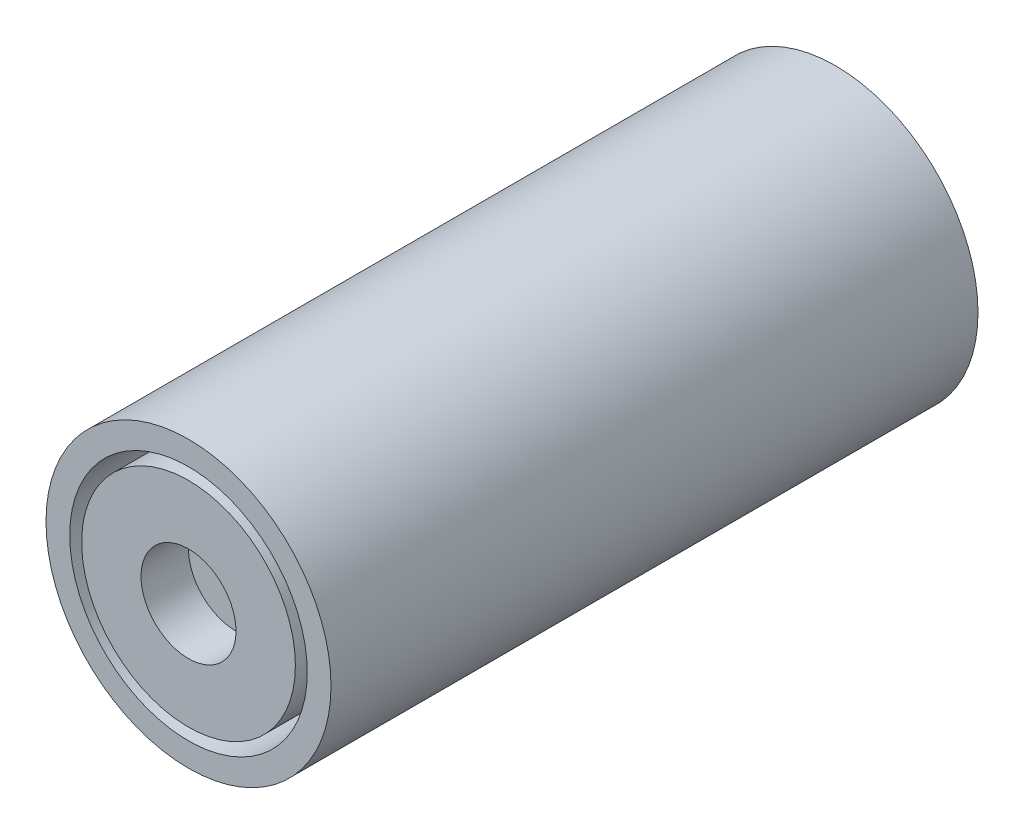
ISO-10303-21;
HEADER;
FILE_DESCRIPTION(('STEP AP214'),'2;1');
FILE_NAME('part.step','',(''),(''),'','','');
FILE_SCHEMA(('AUTOMOTIVE_DESIGN { 1 0 10303 214 1 1 1 1 }'));
ENDSEC;
DATA;
#1=APPLICATION_CONTEXT('core data for automotive mechanical design processes');
#2=APPLICATION_PROTOCOL_DEFINITION('international standard','automotive_design',2000,#1);
#3=PRODUCT_CONTEXT('',#1,'mechanical');
#4=PRODUCT('Part','Part','',(#3));
#5=PRODUCT_RELATED_PRODUCT_CATEGORY('part','',(#4));
#6=PRODUCT_DEFINITION_FORMATION('','',#4);
#7=PRODUCT_DEFINITION_CONTEXT('part definition',#1,'design');
#8=PRODUCT_DEFINITION('design','',#6,#7);
#9=PRODUCT_DEFINITION_SHAPE('','',#8);
#10=(LENGTH_UNIT() NAMED_UNIT(*) SI_UNIT(.MILLI.,.METRE.));
#11=(NAMED_UNIT(*) PLANE_ANGLE_UNIT() SI_UNIT($,.RADIAN.));
#12=(NAMED_UNIT(*) SI_UNIT($,.STERADIAN.) SOLID_ANGLE_UNIT());
#13=UNCERTAINTY_MEASURE_WITH_UNIT(LENGTH_MEASURE(1.E-05),#10,'distance_accuracy_value','');
#14=(GEOMETRIC_REPRESENTATION_CONTEXT(3) GLOBAL_UNCERTAINTY_ASSIGNED_CONTEXT((#13)) GLOBAL_UNIT_ASSIGNED_CONTEXT((#10,
#11,#12)) REPRESENTATION_CONTEXT('',''));
#15=CARTESIAN_POINT('',(0.,0.,0.));
#16=DIRECTION('',(0.,0.,1.));
#17=DIRECTION('',(1.,0.,0.));
#18=AXIS2_PLACEMENT_3D('',#15,#16,#17);
#19=CARTESIAN_POINT('',(0.,0.,-17.2974));
#20=DIRECTION('',(0.,0.,1.));
#21=DIRECTION('',(1.,0.,0.));
#22=AXIS2_PLACEMENT_3D('',#19,#20,#21);
#23=CYLINDRICAL_SURFACE('',#22,3.81);
#24=CARTESIAN_POINT('',(0.,0.,-17.2974));
#25=DIRECTION('',(0.,0.,1.));
#26=DIRECTION('',(1.,0.,0.));
#27=AXIS2_PLACEMENT_3D('',#24,#25,#26);
#28=CIRCLE('',#27,3.81);
#29=CARTESIAN_POINT('',(3.81,0.,-17.2974));
#30=VERTEX_POINT('',#29);
#31=EDGE_CURVE('E11',#30,#30,#28,.T.);
#32=ORIENTED_EDGE('',*,*,#31,.T.);
#33=EDGE_LOOP('',(#32));
#34=FACE_BOUND('',#33,.T.);
#35=CARTESIAN_POINT('',(0.,0.,0.));
#36=DIRECTION('',(0.,0.,1.));
#37=DIRECTION('',(1.,0.,0.));
#38=AXIS2_PLACEMENT_3D('',#35,#36,#37);
#39=CIRCLE('',#38,3.81);
#40=CARTESIAN_POINT('',(3.81,0.,0.));
#41=VERTEX_POINT('',#40);
#42=EDGE_CURVE('E42',#41,#41,#39,.T.);
#43=ORIENTED_EDGE('',*,*,#42,.F.);
#44=EDGE_LOOP('',(#43));
#45=FACE_BOUND('',#44,.T.);
#46=ADVANCED_FACE('F39',(#34,#45),#23,.T.);
#47=CARTESIAN_POINT('',(0.,0.,-17.2974));
#48=DIRECTION('',(0.,0.,1.));
#49=DIRECTION('',(1.,0.,0.));
#50=AXIS2_PLACEMENT_3D('',#47,#48,#49);
#51=PLANE('',#50);
#52=ORIENTED_EDGE('',*,*,#31,.F.);
#53=EDGE_LOOP('',(#52));
#54=FACE_BOUND('',#53,.T.);
#55=ADVANCED_FACE('F95',(#54),#51,.F.);
#56=CARTESIAN_POINT('',(0.,0.,0.));
#57=DIRECTION('',(0.,0.,1.));
#58=DIRECTION('',(1.,0.,0.));
#59=AXIS2_PLACEMENT_3D('',#56,#57,#58);
#60=PLANE('',#59);
#61=CARTESIAN_POINT('',(0.,0.,0.));
#62=DIRECTION('',(0.,0.,1.));
#63=DIRECTION('',(1.,0.,0.));
#64=AXIS2_PLACEMENT_3D('',#61,#62,#63);
#65=CIRCLE('',#64,3.175);
#66=CARTESIAN_POINT('',(3.175,0.,0.));
#67=VERTEX_POINT('',#66);
#68=EDGE_CURVE('E51',#67,#67,#65,.T.);
#69=ORIENTED_EDGE('',*,*,#68,.F.);
#70=EDGE_LOOP('',(#69));
#71=FACE_BOUND('',#70,.T.);
#72=ORIENTED_EDGE('',*,*,#42,.T.);
#73=EDGE_LOOP('',(#72));
#74=FACE_BOUND('',#73,.T.);
#75=ADVANCED_FACE('F81',(#71,#74),#60,.T.);
#76=CARTESIAN_POINT('',(0.,0.,-2.54));
#77=DIRECTION('',(0.,0.,1.));
#78=DIRECTION('',(1.,0.,0.));
#79=AXIS2_PLACEMENT_3D('',#76,#77,#78);
#80=CYLINDRICAL_SURFACE('',#79,3.175);
#81=CARTESIAN_POINT('',(0.,0.,-2.54));
#82=DIRECTION('',(0.,0.,1.));
#83=DIRECTION('',(1.,0.,0.));
#84=AXIS2_PLACEMENT_3D('',#81,#82,#83);
#85=CIRCLE('',#84,3.175);
#86=CARTESIAN_POINT('',(3.175,0.,-2.54));
#87=VERTEX_POINT('',#86);
#88=EDGE_CURVE('E49',#87,#87,#85,.T.);
#89=ORIENTED_EDGE('',*,*,#88,.F.);
#90=EDGE_LOOP('',(#89));
#91=FACE_BOUND('',#90,.T.);
#92=ORIENTED_EDGE('',*,*,#68,.T.);
#93=EDGE_LOOP('',(#92));
#94=FACE_BOUND('',#93,.T.);
#95=ADVANCED_FACE('F91',(#91,#94),#80,.F.);
#96=CARTESIAN_POINT('',(0.,0.,-2.54));
#97=DIRECTION('',(0.,0.,1.));
#98=DIRECTION('',(1.,0.,0.));
#99=AXIS2_PLACEMENT_3D('',#96,#97,#98);
#100=PLANE('',#99);
#101=CARTESIAN_POINT('',(0.,0.,-2.54));
#102=DIRECTION('',(0.,0.,1.));
#103=DIRECTION('',(1.,0.,0.));
#104=AXIS2_PLACEMENT_3D('',#101,#102,#103);
#105=CIRCLE('',#104,2.8575);
#106=CARTESIAN_POINT('',(2.8575,0.,-2.54));
#107=VERTEX_POINT('',#106);
#108=EDGE_CURVE('E54',#107,#107,#105,.T.);
#109=ORIENTED_EDGE('',*,*,#108,.F.);
#110=EDGE_LOOP('',(#109));
#111=FACE_BOUND('',#110,.T.);
#112=ORIENTED_EDGE('',*,*,#88,.T.);
#113=EDGE_LOOP('',(#112));
#114=FACE_BOUND('',#113,.T.);
#115=ADVANCED_FACE('F85',(#111,#114),#100,.T.);
#116=CARTESIAN_POINT('',(0.,0.,-2.54));
#117=DIRECTION('',(0.,0.,1.));
#118=DIRECTION('',(1.,0.,0.));
#119=AXIS2_PLACEMENT_3D('',#116,#117,#118);
#120=CYLINDRICAL_SURFACE('',#119,2.8575);
#121=ORIENTED_EDGE('',*,*,#108,.T.);
#122=EDGE_LOOP('',(#121));
#123=FACE_BOUND('',#122,.T.);
#124=CARTESIAN_POINT('',(0.,0.,0.));
#125=DIRECTION('',(0.,0.,1.));
#126=DIRECTION('',(1.,0.,0.));
#127=AXIS2_PLACEMENT_3D('',#124,#125,#126);
#128=CIRCLE('',#127,2.8575);
#129=CARTESIAN_POINT('',(2.8575,0.,0.));
#130=VERTEX_POINT('',#129);
#131=EDGE_CURVE('E57',#130,#130,#128,.T.);
#132=ORIENTED_EDGE('',*,*,#131,.F.);
#133=EDGE_LOOP('',(#132));
#134=FACE_BOUND('',#133,.T.);
#135=ADVANCED_FACE('F80',(#123,#134),#120,.T.);
#136=CARTESIAN_POINT('',(0.,0.,0.));
#137=DIRECTION('',(0.,0.,1.));
#138=DIRECTION('',(1.,0.,0.));
#139=AXIS2_PLACEMENT_3D('',#136,#137,#138);
#140=CIRCLE('',#139,1.27);
#141=CARTESIAN_POINT('',(1.27,0.,0.));
#142=VERTEX_POINT('',#141);
#143=EDGE_CURVE('E63',#142,#142,#140,.T.);
#144=ORIENTED_EDGE('',*,*,#143,.F.);
#145=EDGE_LOOP('',(#144));
#146=FACE_BOUND('',#145,.T.);
#147=ORIENTED_EDGE('',*,*,#131,.T.);
#148=EDGE_LOOP('',(#147));
#149=FACE_BOUND('',#148,.T.);
#150=ADVANCED_FACE('F74',(#146,#149),#60,.T.);
#151=CARTESIAN_POINT('',(0.,0.,-1.27));
#152=DIRECTION('',(0.,0.,1.));
#153=DIRECTION('',(1.,0.,0.));
#154=AXIS2_PLACEMENT_3D('',#151,#152,#153);
#155=CYLINDRICAL_SURFACE('',#154,1.27);
#156=CARTESIAN_POINT('',(0.,0.,-1.27));
#157=DIRECTION('',(0.,0.,1.));
#158=DIRECTION('',(1.,0.,0.));
#159=AXIS2_PLACEMENT_3D('',#156,#157,#158);
#160=CIRCLE('',#159,1.27);
#161=CARTESIAN_POINT('',(1.27,0.,-1.27));
#162=VERTEX_POINT('',#161);
#163=EDGE_CURVE('E60',#162,#162,#160,.T.);
#164=ORIENTED_EDGE('',*,*,#163,.F.);
#165=EDGE_LOOP('',(#164));
#166=FACE_BOUND('',#165,.T.);
#167=ORIENTED_EDGE('',*,*,#143,.T.);
#168=EDGE_LOOP('',(#167));
#169=FACE_BOUND('',#168,.T.);
#170=ADVANCED_FACE('F71',(#166,#169),#155,.F.);
#171=CARTESIAN_POINT('',(0.,0.,-1.27));
#172=DIRECTION('',(0.,0.,1.));
#173=DIRECTION('',(1.,0.,0.));
#174=AXIS2_PLACEMENT_3D('',#171,#172,#173);
#175=PLANE('',#174);
#176=ORIENTED_EDGE('',*,*,#163,.T.);
#177=EDGE_LOOP('',(#176));
#178=FACE_BOUND('',#177,.T.);
#179=ADVANCED_FACE('F69',(#178),#175,.T.);
#180=CLOSED_SHELL('',(#46,#55,#75,#95,#115,#135,#150,#170,#179));
#181=MANIFOLD_SOLID_BREP('B2',#180);
#182=ADVANCED_BREP_SHAPE_REPRESENTATION('',(#18,#181),#14);
#183=SHAPE_DEFINITION_REPRESENTATION(#9,#182);
ENDSEC;
END-ISO-10303-21;
